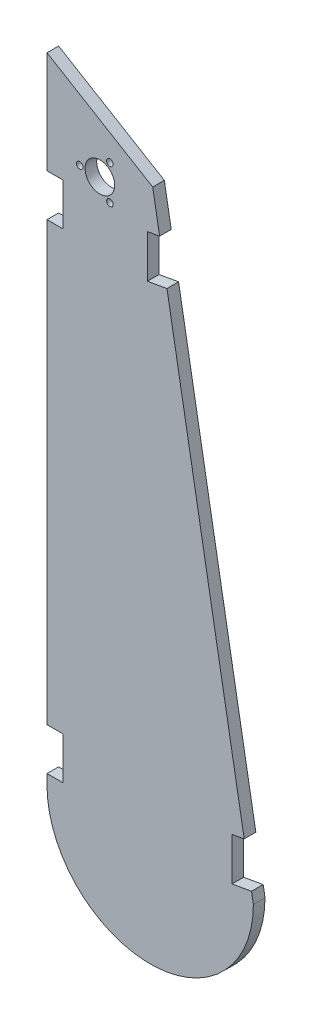
ISO-10303-21;
HEADER;
FILE_DESCRIPTION(('STEP AP214'),'2;1');
FILE_NAME('part.step','',(''),(''),'','','');
FILE_SCHEMA(('AUTOMOTIVE_DESIGN { 1 0 10303 214 1 1 1 1 }'));
ENDSEC;
DATA;
#1=APPLICATION_CONTEXT('core data for automotive mechanical design processes');
#2=APPLICATION_PROTOCOL_DEFINITION('international standard','automotive_design',2000,#1);
#3=PRODUCT_CONTEXT('',#1,'mechanical');
#4=PRODUCT('Part','Part','',(#3));
#5=PRODUCT_RELATED_PRODUCT_CATEGORY('part','',(#4));
#6=PRODUCT_DEFINITION_FORMATION('','',#4);
#7=PRODUCT_DEFINITION_CONTEXT('part definition',#1,'design');
#8=PRODUCT_DEFINITION('design','',#6,#7);
#9=PRODUCT_DEFINITION_SHAPE('','',#8);
#10=(LENGTH_UNIT() NAMED_UNIT(*) SI_UNIT(.MILLI.,.METRE.));
#11=(NAMED_UNIT(*) PLANE_ANGLE_UNIT() SI_UNIT($,.RADIAN.));
#12=(NAMED_UNIT(*) SI_UNIT($,.STERADIAN.) SOLID_ANGLE_UNIT());
#13=UNCERTAINTY_MEASURE_WITH_UNIT(LENGTH_MEASURE(1.E-05),#10,'distance_accuracy_value','');
#14=(GEOMETRIC_REPRESENTATION_CONTEXT(3) GLOBAL_UNCERTAINTY_ASSIGNED_CONTEXT((#13)) GLOBAL_UNIT_ASSIGNED_CONTEXT((#10,
#11,#12)) REPRESENTATION_CONTEXT('',''));
#15=CARTESIAN_POINT('',(0.,0.,0.));
#16=DIRECTION('',(0.,0.,1.));
#17=DIRECTION('',(1.,0.,0.));
#18=AXIS2_PLACEMENT_3D('',#15,#16,#17);
#19=CARTESIAN_POINT('',(50.,270.,5.5));
#20=DIRECTION('',(0.984807753012209,0.173648177666924,0.));
#21=DIRECTION('',(-0.173648177666924,0.984807753012209,0.));
#22=AXIS2_PLACEMENT_3D('',#19,#20,#21);
#23=PLANE('',#22);
#24=DIRECTION('',(0.,0.,-1.));
#25=VECTOR('',#24,1.);
#26=CARTESIAN_POINT('',(56.7364817766692,231.795513371788,5.5));
#27=LINE('',#26,#25);
#28=CARTESIAN_POINT('',(56.7364817766692,231.795513371788,5.5));
#29=VERTEX_POINT('',#28);
#30=CARTESIAN_POINT('',(56.7364817766692,231.795513371788,0.));
#31=VERTEX_POINT('',#30);
#32=EDGE_CURVE('E199',#29,#31,#27,.T.);
#33=ORIENTED_EDGE('',*,*,#32,.F.);
#34=DIRECTION('',(0.173648177666924,-0.984807753012209,0.));
#35=VECTOR('',#34,1.);
#36=CARTESIAN_POINT('',(50.,270.,5.5));
#37=LINE('',#36,#35);
#38=CARTESIAN_POINT('',(93.2635182233308,24.6403956473151,5.5));
#39=VERTEX_POINT('',#38);
#40=EDGE_CURVE('E195',#29,#39,#37,.T.);
#41=ORIENTED_EDGE('',*,*,#40,.T.);
#42=DIRECTION('',(0.,0.,-1.));
#43=VECTOR('',#42,1.);
#44=CARTESIAN_POINT('',(93.2635182233308,24.6403956473151,5.5));
#45=LINE('',#44,#43);
#46=CARTESIAN_POINT('',(93.2635182233308,24.6403956473151,0.));
#47=VERTEX_POINT('',#46);
#48=EDGE_CURVE('E212',#39,#47,#45,.T.);
#49=ORIENTED_EDGE('',*,*,#48,.T.);
#50=DIRECTION('',(0.173648177666924,-0.984807753012209,0.));
#51=VECTOR('',#50,1.);
#52=CARTESIAN_POINT('',(50.,270.,0.));
#53=LINE('',#52,#51);
#54=EDGE_CURVE('E314',#31,#47,#53,.T.);
#55=ORIENTED_EDGE('',*,*,#54,.F.);
#56=EDGE_LOOP('',(#33,#41,#49,#55));
#57=FACE_BOUND('',#56,.T.);
#58=ADVANCED_FACE('F39',(#57),#23,.T.);
#59=CARTESIAN_POINT('',(96.7364817766692,4.94424058707089,0.));
#60=VERTEX_POINT('',#59);
#61=CARTESIAN_POINT('',(97.6082847912837,0.,0.));
#62=VERTEX_POINT('',#61);
#63=EDGE_CURVE('E309',#60,#62,#53,.T.);
#64=ORIENTED_EDGE('',*,*,#63,.F.);
#65=DIRECTION('',(0.,0.,-1.));
#66=VECTOR('',#65,1.);
#67=CARTESIAN_POINT('',(96.7364817766692,4.94424058707089,5.5));
#68=LINE('',#67,#66);
#69=CARTESIAN_POINT('',(96.7364817766692,4.94424058707089,5.5));
#70=VERTEX_POINT('',#69);
#71=EDGE_CURVE('E215',#70,#60,#68,.T.);
#72=ORIENTED_EDGE('',*,*,#71,.F.);
#73=CARTESIAN_POINT('',(97.6082847912837,0.,5.5));
#74=VERTEX_POINT('',#73);
#75=EDGE_CURVE('E293',#70,#74,#37,.T.);
#76=ORIENTED_EDGE('',*,*,#75,.T.);
#77=DIRECTION('',(0.,0.,-1.));
#78=VECTOR('',#77,1.);
#79=CARTESIAN_POINT('',(97.6082847912837,0.,5.5));
#80=LINE('',#79,#78);
#81=EDGE_CURVE('E327',#74,#62,#80,.T.);
#82=ORIENTED_EDGE('',*,*,#81,.T.);
#83=EDGE_LOOP('',(#64,#72,#76,#82));
#84=FACE_BOUND('',#83,.T.);
#85=ADVANCED_FACE('F395',(#84),#23,.T.);
#86=DIRECTION('',(0.,0.,-1.));
#87=VECTOR('',#86,1.);
#88=CARTESIAN_POINT('',(53.2635182233308,251.491668432032,5.5));
#89=LINE('',#88,#87);
#90=CARTESIAN_POINT('',(53.2635182233308,251.491668432032,5.5));
#91=VERTEX_POINT('',#90);
#92=CARTESIAN_POINT('',(53.2635182233308,251.491668432032,0.));
#93=VERTEX_POINT('',#92);
#94=EDGE_CURVE('E202',#91,#93,#89,.T.);
#95=ORIENTED_EDGE('',*,*,#94,.T.);
#96=CARTESIAN_POINT('',(50.,270.,0.));
#97=VERTEX_POINT('',#96);
#98=EDGE_CURVE('E310',#97,#93,#53,.T.);
#99=ORIENTED_EDGE('',*,*,#98,.F.);
#100=DIRECTION('',(0.,0.,-1.));
#101=VECTOR('',#100,1.);
#102=CARTESIAN_POINT('',(50.,270.,5.5));
#103=LINE('',#102,#101);
#104=CARTESIAN_POINT('',(50.,270.,5.5));
#105=VERTEX_POINT('',#104);
#106=EDGE_CURVE('E305',#105,#97,#103,.T.);
#107=ORIENTED_EDGE('',*,*,#106,.F.);
#108=EDGE_CURVE('E295',#105,#91,#37,.T.);
#109=ORIENTED_EDGE('',*,*,#108,.T.);
#110=EDGE_LOOP('',(#95,#99,#107,#109));
#111=FACE_BOUND('',#110,.T.);
#112=ADVANCED_FACE('F353',(#111),#23,.T.);
#113=CARTESIAN_POINT('',(48.8041423956418,0.,5.5));
#114=DIRECTION('',(0.,0.,1.));
#115=DIRECTION('',(1.,0.,0.));
#116=AXIS2_PLACEMENT_3D('',#113,#114,#115);
#117=PLANE('',#116);
#118=DIRECTION('',(-0.984807753012208,-0.173648177666929,0.));
#119=VECTOR('',#118,1.);
#120=CARTESIAN_POINT('',(47.5,230.166872427739,5.5));
#121=LINE('',#120,#119);
#122=CARTESIAN_POINT('',(47.5,230.166872427739,5.5));
#123=VERTEX_POINT('',#122);
#124=EDGE_CURVE('E177',#29,#123,#121,.T.);
#125=ORIENTED_EDGE('',*,*,#124,.T.);
#126=DIRECTION('',(0.,1.,0.));
#127=VECTOR('',#126,1.);
#128=CARTESIAN_POINT('',(47.5,250.475404665454,5.5));
#129=LINE('',#128,#127);
#130=CARTESIAN_POINT('',(47.5,250.475404665454,5.5));
#131=VERTEX_POINT('',#130);
#132=EDGE_CURVE('E184',#123,#131,#129,.T.);
#133=ORIENTED_EDGE('',*,*,#132,.T.);
#134=DIRECTION('',(0.984807753012209,0.173648177666925,0.));
#135=VECTOR('',#134,1.);
#136=CARTESIAN_POINT('',(53.2635182233308,251.491668432032,5.5));
#137=LINE('',#136,#135);
#138=EDGE_CURVE('E181',#131,#91,#137,.T.);
#139=ORIENTED_EDGE('',*,*,#138,.T.);
#140=ORIENTED_EDGE('',*,*,#108,.F.);
#141=DIRECTION('',(0.857492925712544,-0.514495755427526,0.));
#142=VECTOR('',#141,1.);
#143=CARTESIAN_POINT('',(0.,300.,5.5));
#144=LINE('',#143,#142);
#145=CARTESIAN_POINT('',(0.,300.,5.5));
#146=VERTEX_POINT('',#145);
#147=EDGE_CURVE('E290',#146,#105,#144,.T.);
#148=ORIENTED_EDGE('',*,*,#147,.F.);
#149=DIRECTION('',(0.,1.,0.));
#150=VECTOR('',#149,1.);
#151=CARTESIAN_POINT('',(0.,0.,5.5));
#152=LINE('',#151,#150);
#153=CARTESIAN_POINT('',(0.,251.64359090191,5.5));
#154=VERTEX_POINT('',#153);
#155=EDGE_CURVE('E301',#154,#146,#152,.T.);
#156=ORIENTED_EDGE('',*,*,#155,.F.);
#157=DIRECTION('',(1.,0.,0.));
#158=VECTOR('',#157,1.);
#159=CARTESIAN_POINT('',(0.,251.64359090191,5.5));
#160=LINE('',#159,#158);
#161=CARTESIAN_POINT('',(7.5,251.64359090191,5.5));
#162=VERTEX_POINT('',#161);
#163=EDGE_CURVE('E220',#154,#162,#160,.T.);
#164=ORIENTED_EDGE('',*,*,#163,.T.);
#165=DIRECTION('',(0.,-1.,0.));
#166=VECTOR('',#165,1.);
#167=CARTESIAN_POINT('',(7.5,251.64359090191,5.5));
#168=LINE('',#167,#166);
#169=CARTESIAN_POINT('',(7.5,231.64359090191,5.5));
#170=VERTEX_POINT('',#169);
#171=EDGE_CURVE('E223',#162,#170,#168,.T.);
#172=ORIENTED_EDGE('',*,*,#171,.T.);
#173=DIRECTION('',(-1.,0.,0.));
#174=VECTOR('',#173,1.);
#175=CARTESIAN_POINT('',(7.5,231.64359090191,5.5));
#176=LINE('',#175,#174);
#177=CARTESIAN_POINT('',(0.,231.64359090191,5.5));
#178=VERTEX_POINT('',#177);
#179=EDGE_CURVE('E226',#170,#178,#176,.T.);
#180=ORIENTED_EDGE('',*,*,#179,.T.);
#181=CARTESIAN_POINT('',(0.,24.792318117193,5.5));
#182=VERTEX_POINT('',#181);
#183=EDGE_CURVE('E306',#182,#178,#152,.T.);
#184=ORIENTED_EDGE('',*,*,#183,.F.);
#185=DIRECTION('',(1.,0.,0.));
#186=VECTOR('',#185,1.);
#187=CARTESIAN_POINT('',(7.5,24.792318117193,5.5));
#188=LINE('',#187,#186);
#189=CARTESIAN_POINT('',(7.5,24.792318117193,5.5));
#190=VERTEX_POINT('',#189);
#191=EDGE_CURVE('E240',#182,#190,#188,.T.);
#192=ORIENTED_EDGE('',*,*,#191,.T.);
#193=DIRECTION('',(0.,-1.,0.));
#194=VECTOR('',#193,1.);
#195=CARTESIAN_POINT('',(7.5,4.79231811719299,5.5));
#196=LINE('',#195,#194);
#197=CARTESIAN_POINT('',(7.5,4.79231811719299,5.5));
#198=VERTEX_POINT('',#197);
#199=EDGE_CURVE('E243',#190,#198,#196,.T.);
#200=ORIENTED_EDGE('',*,*,#199,.T.);
#201=DIRECTION('',(-1.,0.,0.));
#202=VECTOR('',#201,1.);
#203=CARTESIAN_POINT('',(0.,4.79231811719299,5.5));
#204=LINE('',#203,#202);
#205=CARTESIAN_POINT('',(0.,4.79231811719299,5.5));
#206=VERTEX_POINT('',#205);
#207=EDGE_CURVE('E247',#198,#206,#204,.T.);
#208=ORIENTED_EDGE('',*,*,#207,.T.);
#209=CARTESIAN_POINT('',(0.,0.,5.5));
#210=VERTEX_POINT('',#209);
#211=EDGE_CURVE('E302',#210,#206,#152,.T.);
#212=ORIENTED_EDGE('',*,*,#211,.F.);
#213=CARTESIAN_POINT('',(48.8041423956418,0.,5.5));
#214=DIRECTION('',(0.,0.,1.));
#215=DIRECTION('',(1.,0.,0.));
#216=AXIS2_PLACEMENT_3D('',#213,#214,#215);
#217=CIRCLE('',#216,48.8041423956418);
#218=EDGE_CURVE('E298',#210,#74,#217,.T.);
#219=ORIENTED_EDGE('',*,*,#218,.T.);
#220=ORIENTED_EDGE('',*,*,#75,.F.);
#221=DIRECTION('',(0.98480775301221,0.173648177666922,0.));
#222=VECTOR('',#221,1.);
#223=CARTESIAN_POINT('',(87.5,3.31559964302212,5.5));
#224=LINE('',#223,#222);
#225=CARTESIAN_POINT('',(87.5,3.31559964302212,5.5));
#226=VERTEX_POINT('',#225);
#227=EDGE_CURVE('E207',#226,#70,#224,.T.);
#228=ORIENTED_EDGE('',*,*,#227,.F.);
#229=DIRECTION('',(0.,-1.,0.));
#230=VECTOR('',#229,1.);
#231=CARTESIAN_POINT('',(87.5,23.624131880737,5.5));
#232=LINE('',#231,#230);
#233=CARTESIAN_POINT('',(87.5,23.624131880737,5.5));
#234=VERTEX_POINT('',#233);
#235=EDGE_CURVE('E201',#234,#226,#232,.T.);
#236=ORIENTED_EDGE('',*,*,#235,.F.);
#237=DIRECTION('',(-0.984807753012209,-0.173648177666924,0.));
#238=VECTOR('',#237,1.);
#239=CARTESIAN_POINT('',(93.2635182233308,24.6403956473151,5.5));
#240=LINE('',#239,#238);
#241=EDGE_CURVE('E209',#39,#234,#240,.T.);
#242=ORIENTED_EDGE('',*,*,#241,.F.);
#243=ORIENTED_EDGE('',*,*,#40,.F.);
#244=EDGE_LOOP('',(#125,#133,#139,#140,#148,#156,#164,#172,#180,#184,#192,#200,#208,#212,#219,
#220,#228,#236,#242,#243));
#245=FACE_BOUND('',#244,.T.);
#246=CARTESIAN_POINT('',(29.75,269.870832237862,5.5));
#247=DIRECTION('',(0.,0.,-1.));
#248=DIRECTION('',(0.500000000000004,0.866025403784436,0.));
#249=AXIS2_PLACEMENT_3D('',#246,#247,#248);
#250=CIRCLE('',#249,1.55000000000001);
#251=CARTESIAN_POINT('',(30.525,271.213171613728,5.5));
#252=VERTEX_POINT('',#251);
#253=EDGE_CURVE('E266',#252,#252,#250,.T.);
#254=ORIENTED_EDGE('',*,*,#253,.T.);
#255=EDGE_LOOP('',(#254));
#256=FACE_BOUND('',#255,.T.);
#257=CARTESIAN_POINT('',(29.7499999999999,253.416349565958,5.5));
#258=DIRECTION('',(0.,0.,-1.));
#259=DIRECTION('',(0.499999999999992,-0.866025403784443,0.));
#260=AXIS2_PLACEMENT_3D('',#257,#258,#259);
#261=CIRCLE('',#260,1.55000000000001);
#262=CARTESIAN_POINT('',(30.5249999999999,252.074010190092,5.5));
#263=VERTEX_POINT('',#262);
#264=EDGE_CURVE('E273',#263,#263,#261,.T.);
#265=ORIENTED_EDGE('',*,*,#264,.T.);
#266=EDGE_LOOP('',(#265));
#267=FACE_BOUND('',#266,.T.);
#268=CARTESIAN_POINT('',(15.5,261.64359090191,5.5));
#269=DIRECTION('',(0.,0.,-1.));
#270=DIRECTION('',(-1.,0.,0.));
#271=AXIS2_PLACEMENT_3D('',#268,#269,#270);
#272=CIRCLE('',#271,1.55000000000001);
#273=CARTESIAN_POINT('',(13.95,261.64359090191,5.5));
#274=VERTEX_POINT('',#273);
#275=EDGE_CURVE('E278',#274,#274,#272,.T.);
#276=ORIENTED_EDGE('',*,*,#275,.T.);
#277=EDGE_LOOP('',(#276));
#278=FACE_BOUND('',#277,.T.);
#279=CARTESIAN_POINT('',(25.,261.64359090191,5.5));
#280=DIRECTION('',(0.,0.,-1.));
#281=DIRECTION('',(-1.,0.,0.));
#282=AXIS2_PLACEMENT_3D('',#279,#280,#281);
#283=CIRCLE('',#282,7.);
#284=CARTESIAN_POINT('',(18.,261.64359090191,5.5));
#285=VERTEX_POINT('',#284);
#286=EDGE_CURVE('E284',#285,#285,#283,.T.);
#287=ORIENTED_EDGE('',*,*,#286,.T.);
#288=EDGE_LOOP('',(#287));
#289=FACE_BOUND('',#288,.T.);
#290=ADVANCED_FACE('F192',(#245,#256,#267,#278,#289),#117,.T.);
#291=CARTESIAN_POINT('',(48.8041423956418,0.,0.));
#292=DIRECTION('',(0.,0.,1.));
#293=DIRECTION('',(1.,0.,0.));
#294=AXIS2_PLACEMENT_3D('',#291,#292,#293);
#295=PLANE('',#294);
#296=CARTESIAN_POINT('',(25.,261.64359090191,0.));
#297=DIRECTION('',(0.,0.,-1.));
#298=DIRECTION('',(-1.,0.,0.));
#299=AXIS2_PLACEMENT_3D('',#296,#297,#298);
#300=CIRCLE('',#299,7.);
#301=CARTESIAN_POINT('',(18.,261.64359090191,0.));
#302=VERTEX_POINT('',#301);
#303=EDGE_CURVE('E281',#302,#302,#300,.T.);
#304=ORIENTED_EDGE('',*,*,#303,.F.);
#305=EDGE_LOOP('',(#304));
#306=FACE_BOUND('',#305,.T.);
#307=CARTESIAN_POINT('',(15.5,261.64359090191,0.));
#308=DIRECTION('',(0.,0.,-1.));
#309=DIRECTION('',(-1.,0.,0.));
#310=AXIS2_PLACEMENT_3D('',#307,#308,#309);
#311=CIRCLE('',#310,1.55000000000001);
#312=CARTESIAN_POINT('',(13.95,261.64359090191,0.));
#313=VERTEX_POINT('',#312);
#314=EDGE_CURVE('E269',#313,#313,#311,.T.);
#315=ORIENTED_EDGE('',*,*,#314,.F.);
#316=EDGE_LOOP('',(#315));
#317=FACE_BOUND('',#316,.T.);
#318=CARTESIAN_POINT('',(29.7499999999999,253.416349565958,0.));
#319=DIRECTION('',(0.,0.,-1.));
#320=DIRECTION('',(0.499999999999992,-0.866025403784443,0.));
#321=AXIS2_PLACEMENT_3D('',#318,#319,#320);
#322=CIRCLE('',#321,1.55000000000001);
#323=CARTESIAN_POINT('',(30.5249999999999,252.074010190092,0.));
#324=VERTEX_POINT('',#323);
#325=EDGE_CURVE('E258',#324,#324,#322,.T.);
#326=ORIENTED_EDGE('',*,*,#325,.F.);
#327=EDGE_LOOP('',(#326));
#328=FACE_BOUND('',#327,.T.);
#329=CARTESIAN_POINT('',(29.75,269.870832237862,0.));
#330=DIRECTION('',(0.,0.,-1.));
#331=DIRECTION('',(0.500000000000004,0.866025403784436,0.));
#332=AXIS2_PLACEMENT_3D('',#329,#330,#331);
#333=CIRCLE('',#332,1.55000000000001);
#334=CARTESIAN_POINT('',(30.525,271.213171613728,0.));
#335=VERTEX_POINT('',#334);
#336=EDGE_CURVE('E270',#335,#335,#333,.T.);
#337=ORIENTED_EDGE('',*,*,#336,.F.);
#338=EDGE_LOOP('',(#337));
#339=FACE_BOUND('',#338,.T.);
#340=DIRECTION('',(0.,-1.,0.));
#341=VECTOR('',#340,1.);
#342=CARTESIAN_POINT('',(47.5,0.,0.));
#343=LINE('',#342,#341);
#344=CARTESIAN_POINT('',(47.5,250.475404665454,0.));
#345=VERTEX_POINT('',#344);
#346=CARTESIAN_POINT('',(47.5,230.166872427739,0.));
#347=VERTEX_POINT('',#346);
#348=EDGE_CURVE('E345',#345,#347,#343,.T.);
#349=ORIENTED_EDGE('',*,*,#348,.T.);
#350=DIRECTION('',(0.984807753012208,0.173648177666929,0.));
#351=VECTOR('',#350,1.);
#352=CARTESIAN_POINT('',(9.40396434236243,223.449513483266,0.));
#353=LINE('',#352,#351);
#354=EDGE_CURVE('E11',#347,#31,#353,.T.);
#355=ORIENTED_EDGE('',*,*,#354,.T.);
#356=ORIENTED_EDGE('',*,*,#54,.T.);
#357=DIRECTION('',(0.984807753012209,0.173648177666924,0.));
#358=VECTOR('',#357,1.);
#359=CARTESIAN_POINT('',(45.9310007890251,16.2943957587935,0.));
#360=LINE('',#359,#358);
#361=CARTESIAN_POINT('',(87.5,23.624131880737,0.));
#362=VERTEX_POINT('',#361);
#363=EDGE_CURVE('E339',#362,#47,#360,.T.);
#364=ORIENTED_EDGE('',*,*,#363,.F.);
#365=DIRECTION('',(0.,1.,0.));
#366=VECTOR('',#365,1.);
#367=CARTESIAN_POINT('',(87.5,0.,0.));
#368=LINE('',#367,#366);
#369=CARTESIAN_POINT('',(87.5,3.31559964302212,0.));
#370=VERTEX_POINT('',#369);
#371=EDGE_CURVE('E341',#370,#362,#368,.T.);
#372=ORIENTED_EDGE('',*,*,#371,.F.);
#373=DIRECTION('',(-0.984807753012209,-0.173648177666922,0.));
#374=VECTOR('',#373,1.);
#375=CARTESIAN_POINT('',(49.4039643423635,-3.40175930145061,0.));
#376=LINE('',#375,#374);
#377=EDGE_CURVE('E343',#60,#370,#376,.T.);
#378=ORIENTED_EDGE('',*,*,#377,.F.);
#379=ORIENTED_EDGE('',*,*,#63,.T.);
#380=CARTESIAN_POINT('',(48.8041423956418,0.,0.));
#381=DIRECTION('',(0.,0.,1.));
#382=DIRECTION('',(1.,0.,0.));
#383=AXIS2_PLACEMENT_3D('',#380,#381,#382);
#384=CIRCLE('',#383,48.8041423956418);
#385=CARTESIAN_POINT('',(0.,0.,0.));
#386=VERTEX_POINT('',#385);
#387=EDGE_CURVE('E313',#386,#62,#384,.T.);
#388=ORIENTED_EDGE('',*,*,#387,.F.);
#389=DIRECTION('',(0.,1.,0.));
#390=VECTOR('',#389,1.);
#391=CARTESIAN_POINT('',(0.,0.,0.));
#392=LINE('',#391,#390);
#393=CARTESIAN_POINT('',(0.,4.79231811719299,0.));
#394=VERTEX_POINT('',#393);
#395=EDGE_CURVE('E294',#386,#394,#392,.T.);
#396=ORIENTED_EDGE('',*,*,#395,.T.);
#397=DIRECTION('',(-1.,0.,0.));
#398=VECTOR('',#397,1.);
#399=CARTESIAN_POINT('',(0.,4.79231811719299,0.));
#400=LINE('',#399,#398);
#401=CARTESIAN_POINT('',(7.5,4.79231811719299,0.));
#402=VERTEX_POINT('',#401);
#403=EDGE_CURVE('E244',#402,#394,#400,.T.);
#404=ORIENTED_EDGE('',*,*,#403,.F.);
#405=DIRECTION('',(0.,-1.,0.));
#406=VECTOR('',#405,1.);
#407=CARTESIAN_POINT('',(7.5,4.79231811719299,0.));
#408=LINE('',#407,#406);
#409=CARTESIAN_POINT('',(7.5,24.792318117193,0.));
#410=VERTEX_POINT('',#409);
#411=EDGE_CURVE('E252',#410,#402,#408,.T.);
#412=ORIENTED_EDGE('',*,*,#411,.F.);
#413=DIRECTION('',(1.,0.,0.));
#414=VECTOR('',#413,1.);
#415=CARTESIAN_POINT('',(7.5,24.792318117193,0.));
#416=LINE('',#415,#414);
#417=CARTESIAN_POINT('',(0.,24.792318117193,0.));
#418=VERTEX_POINT('',#417);
#419=EDGE_CURVE('E232',#418,#410,#416,.T.);
#420=ORIENTED_EDGE('',*,*,#419,.F.);
#421=CARTESIAN_POINT('',(0.,231.64359090191,0.));
#422=VERTEX_POINT('',#421);
#423=EDGE_CURVE('E320',#418,#422,#392,.T.);
#424=ORIENTED_EDGE('',*,*,#423,.T.);
#425=DIRECTION('',(1.,0.,0.));
#426=VECTOR('',#425,1.);
#427=CARTESIAN_POINT('',(48.804142395641,231.643590901911,0.));
#428=LINE('',#427,#426);
#429=CARTESIAN_POINT('',(7.5,231.64359090191,0.));
#430=VERTEX_POINT('',#429);
#431=EDGE_CURVE('E333',#422,#430,#428,.T.);
#432=ORIENTED_EDGE('',*,*,#431,.T.);
#433=DIRECTION('',(0.,1.,0.));
#434=VECTOR('',#433,1.);
#435=CARTESIAN_POINT('',(7.49999999999997,0.,0.));
#436=LINE('',#435,#434);
#437=CARTESIAN_POINT('',(7.50000000000001,251.64359090191,0.));
#438=VERTEX_POINT('',#437);
#439=EDGE_CURVE('E324',#430,#438,#436,.T.);
#440=ORIENTED_EDGE('',*,*,#439,.T.);
#441=DIRECTION('',(-1.,0.,0.));
#442=VECTOR('',#441,1.);
#443=CARTESIAN_POINT('',(48.8041423956418,251.64359090191,0.));
#444=LINE('',#443,#442);
#445=CARTESIAN_POINT('',(0.,251.64359090191,0.));
#446=VERTEX_POINT('',#445);
#447=EDGE_CURVE('E336',#438,#446,#444,.T.);
#448=ORIENTED_EDGE('',*,*,#447,.T.);
#449=CARTESIAN_POINT('',(0.,300.,0.));
#450=VERTEX_POINT('',#449);
#451=EDGE_CURVE('E317',#446,#450,#392,.T.);
#452=ORIENTED_EDGE('',*,*,#451,.T.);
#453=DIRECTION('',(0.857492925712544,-0.514495755427526,0.));
#454=VECTOR('',#453,1.);
#455=CARTESIAN_POINT('',(0.,300.,0.));
#456=LINE('',#455,#454);
#457=EDGE_CURVE('E287',#450,#97,#456,.T.);
#458=ORIENTED_EDGE('',*,*,#457,.T.);
#459=ORIENTED_EDGE('',*,*,#98,.T.);
#460=DIRECTION('',(-0.984807753012209,-0.173648177666925,0.));
#461=VECTOR('',#460,1.);
#462=CARTESIAN_POINT('',(5.93100078902478,243.145668543511,0.));
#463=LINE('',#462,#461);
#464=EDGE_CURVE('E47',#93,#345,#463,.T.);
#465=ORIENTED_EDGE('',*,*,#464,.T.);
#466=EDGE_LOOP('',(#349,#355,#356,#364,#372,#378,#379,#388,#396,#404,#412,#420,#424,#432,#440,
#448,#452,#458,#459,#465));
#467=FACE_BOUND('',#466,.T.);
#468=ADVANCED_FACE('F348',(#306,#317,#328,#339,#467),#295,.F.);
#469=CARTESIAN_POINT('',(0.,0.,5.5));
#470=DIRECTION('',(-1.,0.,0.));
#471=DIRECTION('',(0.,0.,1.));
#472=AXIS2_PLACEMENT_3D('',#469,#470,#471);
#473=PLANE('',#472);
#474=DIRECTION('',(0.,0.,-1.));
#475=VECTOR('',#474,1.);
#476=CARTESIAN_POINT('',(0.,251.64359090191,5.5));
#477=LINE('',#476,#475);
#478=EDGE_CURVE('E230',#154,#446,#477,.T.);
#479=ORIENTED_EDGE('',*,*,#478,.F.);
#480=ORIENTED_EDGE('',*,*,#155,.T.);
#481=DIRECTION('',(0.,0.,-1.));
#482=VECTOR('',#481,1.);
#483=CARTESIAN_POINT('',(0.,300.,5.5));
#484=LINE('',#483,#482);
#485=EDGE_CURVE('E321',#146,#450,#484,.T.);
#486=ORIENTED_EDGE('',*,*,#485,.T.);
#487=ORIENTED_EDGE('',*,*,#451,.F.);
#488=EDGE_LOOP('',(#479,#480,#486,#487));
#489=FACE_BOUND('',#488,.T.);
#490=ADVANCED_FACE('F363',(#489),#473,.T.);
#491=DIRECTION('',(0.,0.,-1.));
#492=VECTOR('',#491,1.);
#493=CARTESIAN_POINT('',(0.,231.64359090191,5.5));
#494=LINE('',#493,#492);
#495=EDGE_CURVE('E233',#178,#422,#494,.T.);
#496=ORIENTED_EDGE('',*,*,#495,.T.);
#497=ORIENTED_EDGE('',*,*,#423,.F.);
#498=DIRECTION('',(0.,0.,-1.));
#499=VECTOR('',#498,1.);
#500=CARTESIAN_POINT('',(0.,24.792318117193,5.5));
#501=LINE('',#500,#499);
#502=EDGE_CURVE('E256',#182,#418,#501,.T.);
#503=ORIENTED_EDGE('',*,*,#502,.F.);
#504=ORIENTED_EDGE('',*,*,#183,.T.);
#505=EDGE_LOOP('',(#496,#497,#503,#504));
#506=FACE_BOUND('',#505,.T.);
#507=ADVANCED_FACE('F368',(#506),#473,.T.);
#508=CARTESIAN_POINT('',(0.,300.,5.5));
#509=DIRECTION('',(0.514495755427526,0.857492925712545,0.));
#510=DIRECTION('',(-0.857492925712545,0.514495755427526,0.));
#511=AXIS2_PLACEMENT_3D('',#508,#509,#510);
#512=PLANE('',#511);
#513=ORIENTED_EDGE('',*,*,#457,.F.);
#514=ORIENTED_EDGE('',*,*,#485,.F.);
#515=ORIENTED_EDGE('',*,*,#147,.T.);
#516=ORIENTED_EDGE('',*,*,#106,.T.);
#517=EDGE_LOOP('',(#513,#514,#515,#516));
#518=FACE_BOUND('',#517,.T.);
#519=ADVANCED_FACE('F41',(#518),#512,.T.);
#520=DIRECTION('',(0.,0.,-1.));
#521=VECTOR('',#520,1.);
#522=CARTESIAN_POINT('',(0.,4.79231811719299,5.5));
#523=LINE('',#522,#521);
#524=EDGE_CURVE('E259',#206,#394,#523,.T.);
#525=ORIENTED_EDGE('',*,*,#524,.T.);
#526=ORIENTED_EDGE('',*,*,#395,.F.);
#527=DIRECTION('',(0.,0.,-1.));
#528=VECTOR('',#527,1.);
#529=CARTESIAN_POINT('',(0.,0.,5.5));
#530=LINE('',#529,#528);
#531=EDGE_CURVE('E325',#210,#386,#530,.T.);
#532=ORIENTED_EDGE('',*,*,#531,.F.);
#533=ORIENTED_EDGE('',*,*,#211,.T.);
#534=EDGE_LOOP('',(#525,#526,#532,#533));
#535=FACE_BOUND('',#534,.T.);
#536=ADVANCED_FACE('F417',(#535),#473,.T.);
#537=CARTESIAN_POINT('',(48.8041423956418,0.,5.5));
#538=DIRECTION('',(0.,0.,-1.));
#539=DIRECTION('',(-1.,0.,0.));
#540=AXIS2_PLACEMENT_3D('',#537,#538,#539);
#541=CYLINDRICAL_SURFACE('',#540,48.8041423956418);
#542=ORIENTED_EDGE('',*,*,#387,.T.);
#543=ORIENTED_EDGE('',*,*,#81,.F.);
#544=ORIENTED_EDGE('',*,*,#218,.F.);
#545=ORIENTED_EDGE('',*,*,#531,.T.);
#546=EDGE_LOOP('',(#542,#543,#544,#545));
#547=FACE_BOUND('',#546,.T.);
#548=ADVANCED_FACE('F419',(#547),#541,.T.);
#549=CARTESIAN_POINT('',(25.,261.64359090191,5.5));
#550=DIRECTION('',(0.,0.,-1.));
#551=DIRECTION('',(-1.,0.,0.));
#552=AXIS2_PLACEMENT_3D('',#549,#550,#551);
#553=CYLINDRICAL_SURFACE('',#552,7.);
#554=ORIENTED_EDGE('',*,*,#286,.F.);
#555=EDGE_LOOP('',(#554));
#556=FACE_BOUND('',#555,.T.);
#557=ORIENTED_EDGE('',*,*,#303,.T.);
#558=EDGE_LOOP('',(#557));
#559=FACE_BOUND('',#558,.T.);
#560=ADVANCED_FACE('F414',(#556,#559),#553,.F.);
#561=CARTESIAN_POINT('',(15.5,261.64359090191,5.5));
#562=DIRECTION('',(0.,0.,-1.));
#563=DIRECTION('',(-1.,0.,0.));
#564=AXIS2_PLACEMENT_3D('',#561,#562,#563);
#565=CYLINDRICAL_SURFACE('',#564,1.55000000000001);
#566=ORIENTED_EDGE('',*,*,#275,.F.);
#567=EDGE_LOOP('',(#566));
#568=FACE_BOUND('',#567,.T.);
#569=ORIENTED_EDGE('',*,*,#314,.T.);
#570=EDGE_LOOP('',(#569));
#571=FACE_BOUND('',#570,.T.);
#572=ADVANCED_FACE('F428',(#568,#571),#565,.F.);
#573=CARTESIAN_POINT('',(29.7499999999999,253.416349565958,5.5));
#574=DIRECTION('',(0.,0.,-1.));
#575=DIRECTION('',(-1.,0.,0.));
#576=AXIS2_PLACEMENT_3D('',#573,#574,#575);
#577=CYLINDRICAL_SURFACE('',#576,1.55000000000001);
#578=ORIENTED_EDGE('',*,*,#264,.F.);
#579=EDGE_LOOP('',(#578));
#580=FACE_BOUND('',#579,.T.);
#581=ORIENTED_EDGE('',*,*,#325,.T.);
#582=EDGE_LOOP('',(#581));
#583=FACE_BOUND('',#582,.T.);
#584=ADVANCED_FACE('F454',(#580,#583),#577,.F.);
#585=CARTESIAN_POINT('',(29.75,269.870832237862,5.5));
#586=DIRECTION('',(0.,0.,-1.));
#587=DIRECTION('',(-1.,0.,0.));
#588=AXIS2_PLACEMENT_3D('',#585,#586,#587);
#589=CYLINDRICAL_SURFACE('',#588,1.55000000000001);
#590=ORIENTED_EDGE('',*,*,#253,.F.);
#591=EDGE_LOOP('',(#590));
#592=FACE_BOUND('',#591,.T.);
#593=ORIENTED_EDGE('',*,*,#336,.T.);
#594=EDGE_LOOP('',(#593));
#595=FACE_BOUND('',#594,.T.);
#596=ADVANCED_FACE('F447',(#592,#595),#589,.F.);
#597=CARTESIAN_POINT('',(7.5,24.792318117193,5.5));
#598=DIRECTION('',(0.,1.,0.));
#599=DIRECTION('',(0.,0.,1.));
#600=AXIS2_PLACEMENT_3D('',#597,#598,#599);
#601=PLANE('',#600);
#602=ORIENTED_EDGE('',*,*,#419,.T.);
#603=DIRECTION('',(0.,0.,-1.));
#604=VECTOR('',#603,1.);
#605=CARTESIAN_POINT('',(7.5,24.792318117193,5.5));
#606=LINE('',#605,#604);
#607=EDGE_CURVE('E250',#190,#410,#606,.T.);
#608=ORIENTED_EDGE('',*,*,#607,.F.);
#609=ORIENTED_EDGE('',*,*,#191,.F.);
#610=ORIENTED_EDGE('',*,*,#502,.T.);
#611=EDGE_LOOP('',(#602,#608,#609,#610));
#612=FACE_BOUND('',#611,.T.);
#613=ADVANCED_FACE('F445',(#612),#601,.F.);
#614=CARTESIAN_POINT('',(0.,4.79231811719299,5.5));
#615=DIRECTION('',(0.,-1.,0.));
#616=DIRECTION('',(1.,0.,0.));
#617=AXIS2_PLACEMENT_3D('',#614,#615,#616);
#618=PLANE('',#617);
#619=ORIENTED_EDGE('',*,*,#403,.T.);
#620=ORIENTED_EDGE('',*,*,#524,.F.);
#621=ORIENTED_EDGE('',*,*,#207,.F.);
#622=DIRECTION('',(0.,0.,-1.));
#623=VECTOR('',#622,1.);
#624=CARTESIAN_POINT('',(7.5,4.79231811719299,5.5));
#625=LINE('',#624,#623);
#626=EDGE_CURVE('E262',#198,#402,#625,.T.);
#627=ORIENTED_EDGE('',*,*,#626,.T.);
#628=EDGE_LOOP('',(#619,#620,#621,#627));
#629=FACE_BOUND('',#628,.T.);
#630=ADVANCED_FACE('F440',(#629),#618,.F.);
#631=CARTESIAN_POINT('',(7.5,4.79231811719299,5.5));
#632=DIRECTION('',(1.,0.,0.));
#633=DIRECTION('',(0.,1.,0.));
#634=AXIS2_PLACEMENT_3D('',#631,#632,#633);
#635=PLANE('',#634);
#636=ORIENTED_EDGE('',*,*,#411,.T.);
#637=ORIENTED_EDGE('',*,*,#626,.F.);
#638=ORIENTED_EDGE('',*,*,#199,.F.);
#639=ORIENTED_EDGE('',*,*,#607,.T.);
#640=EDGE_LOOP('',(#636,#637,#638,#639));
#641=FACE_BOUND('',#640,.T.);
#642=ADVANCED_FACE('F443',(#641),#635,.F.);
#643=CARTESIAN_POINT('',(0.,251.64359090191,5.5));
#644=DIRECTION('',(0.,1.,0.));
#645=DIRECTION('',(0.,0.,1.));
#646=AXIS2_PLACEMENT_3D('',#643,#644,#645);
#647=PLANE('',#646);
#648=DIRECTION('',(0.,0.,-1.));
#649=VECTOR('',#648,1.);
#650=CARTESIAN_POINT('',(7.5,251.64359090191,5.5));
#651=LINE('',#650,#649);
#652=EDGE_CURVE('E229',#162,#438,#651,.T.);
#653=ORIENTED_EDGE('',*,*,#652,.F.);
#654=ORIENTED_EDGE('',*,*,#163,.F.);
#655=ORIENTED_EDGE('',*,*,#478,.T.);
#656=ORIENTED_EDGE('',*,*,#447,.F.);
#657=EDGE_LOOP('',(#653,#654,#655,#656));
#658=FACE_BOUND('',#657,.T.);
#659=ADVANCED_FACE('F379',(#658),#647,.F.);
#660=CARTESIAN_POINT('',(7.5,231.64359090191,5.5));
#661=DIRECTION('',(0.,-1.,0.));
#662=DIRECTION('',(1.,0.,0.));
#663=AXIS2_PLACEMENT_3D('',#660,#661,#662);
#664=PLANE('',#663);
#665=ORIENTED_EDGE('',*,*,#495,.F.);
#666=ORIENTED_EDGE('',*,*,#179,.F.);
#667=DIRECTION('',(0.,0.,-1.));
#668=VECTOR('',#667,1.);
#669=CARTESIAN_POINT('',(7.5,231.64359090191,5.5));
#670=LINE('',#669,#668);
#671=EDGE_CURVE('E236',#170,#430,#670,.T.);
#672=ORIENTED_EDGE('',*,*,#671,.T.);
#673=ORIENTED_EDGE('',*,*,#431,.F.);
#674=EDGE_LOOP('',(#665,#666,#672,#673));
#675=FACE_BOUND('',#674,.T.);
#676=ADVANCED_FACE('F374',(#675),#664,.F.);
#677=CARTESIAN_POINT('',(7.5,251.64359090191,5.5));
#678=DIRECTION('',(1.,0.,0.));
#679=DIRECTION('',(0.,1.,0.));
#680=AXIS2_PLACEMENT_3D('',#677,#678,#679);
#681=PLANE('',#680);
#682=ORIENTED_EDGE('',*,*,#671,.F.);
#683=ORIENTED_EDGE('',*,*,#171,.F.);
#684=ORIENTED_EDGE('',*,*,#652,.T.);
#685=ORIENTED_EDGE('',*,*,#439,.F.);
#686=EDGE_LOOP('',(#682,#683,#684,#685));
#687=FACE_BOUND('',#686,.T.);
#688=ADVANCED_FACE('F381',(#687),#681,.F.);
#689=CARTESIAN_POINT('',(87.5,23.624131880737,5.5));
#690=DIRECTION('',(1.,0.,0.));
#691=DIRECTION('',(0.,0.,-1.));
#692=AXIS2_PLACEMENT_3D('',#689,#690,#691);
#693=PLANE('',#692);
#694=ORIENTED_EDGE('',*,*,#371,.T.);
#695=DIRECTION('',(0.,0.,-1.));
#696=VECTOR('',#695,1.);
#697=CARTESIAN_POINT('',(87.5,23.624131880737,5.5));
#698=LINE('',#697,#696);
#699=EDGE_CURVE('E62',#234,#362,#698,.T.);
#700=ORIENTED_EDGE('',*,*,#699,.F.);
#701=ORIENTED_EDGE('',*,*,#235,.T.);
#702=DIRECTION('',(0.,0.,-1.));
#703=VECTOR('',#702,1.);
#704=CARTESIAN_POINT('',(87.5,3.31559964302212,5.5));
#705=LINE('',#704,#703);
#706=EDGE_CURVE('E217',#226,#370,#705,.T.);
#707=ORIENTED_EDGE('',*,*,#706,.T.);
#708=EDGE_LOOP('',(#694,#700,#701,#707));
#709=FACE_BOUND('',#708,.T.);
#710=ADVANCED_FACE('F383',(#709),#693,.T.);
#711=CARTESIAN_POINT('',(87.5,3.31559964302212,5.5));
#712=DIRECTION('',(-0.173648177666922,0.984807753012209,0.));
#713=DIRECTION('',(-0.984807753012209,-0.173648177666922,0.));
#714=AXIS2_PLACEMENT_3D('',#711,#712,#713);
#715=PLANE('',#714);
#716=ORIENTED_EDGE('',*,*,#377,.T.);
#717=ORIENTED_EDGE('',*,*,#706,.F.);
#718=ORIENTED_EDGE('',*,*,#227,.T.);
#719=ORIENTED_EDGE('',*,*,#71,.T.);
#720=EDGE_LOOP('',(#716,#717,#718,#719));
#721=FACE_BOUND('',#720,.T.);
#722=ADVANCED_FACE('F389',(#721),#715,.T.);
#723=CARTESIAN_POINT('',(93.2635182233308,24.6403956473151,5.5));
#724=DIRECTION('',(0.173648177666924,-0.984807753012209,0.));
#725=DIRECTION('',(0.984807753012209,0.173648177666924,0.));
#726=AXIS2_PLACEMENT_3D('',#723,#724,#725);
#727=PLANE('',#726);
#728=ORIENTED_EDGE('',*,*,#363,.T.);
#729=ORIENTED_EDGE('',*,*,#48,.F.);
#730=ORIENTED_EDGE('',*,*,#241,.T.);
#731=ORIENTED_EDGE('',*,*,#699,.T.);
#732=EDGE_LOOP('',(#728,#729,#730,#731));
#733=FACE_BOUND('',#732,.T.);
#734=ADVANCED_FACE('F566',(#733),#727,.T.);
#735=CARTESIAN_POINT('',(47.5,230.166872427739,5.5));
#736=DIRECTION('',(0.173648177666929,-0.984807753012208,0.));
#737=DIRECTION('',(0.984807753012208,0.173648177666929,0.));
#738=AXIS2_PLACEMENT_3D('',#735,#736,#737);
#739=PLANE('',#738);
#740=DIRECTION('',(0.,0.,-1.));
#741=VECTOR('',#740,1.);
#742=CARTESIAN_POINT('',(47.5,230.166872427739,5.5));
#743=LINE('',#742,#741);
#744=EDGE_CURVE('E54',#123,#347,#743,.T.);
#745=ORIENTED_EDGE('',*,*,#744,.F.);
#746=ORIENTED_EDGE('',*,*,#124,.F.);
#747=ORIENTED_EDGE('',*,*,#32,.T.);
#748=ORIENTED_EDGE('',*,*,#354,.F.);
#749=EDGE_LOOP('',(#745,#746,#747,#748));
#750=FACE_BOUND('',#749,.T.);
#751=ADVANCED_FACE('F175',(#750),#739,.F.);
#752=CARTESIAN_POINT('',(53.2635182233308,251.491668432032,5.5));
#753=DIRECTION('',(-0.173648177666925,0.984807753012209,0.));
#754=DIRECTION('',(-0.984807753012209,-0.173648177666925,0.));
#755=AXIS2_PLACEMENT_3D('',#752,#753,#754);
#756=PLANE('',#755);
#757=ORIENTED_EDGE('',*,*,#94,.F.);
#758=ORIENTED_EDGE('',*,*,#138,.F.);
#759=DIRECTION('',(0.,0.,-1.));
#760=VECTOR('',#759,1.);
#761=CARTESIAN_POINT('',(47.5,250.475404665454,5.5));
#762=LINE('',#761,#760);
#763=EDGE_CURVE('E180',#131,#345,#762,.T.);
#764=ORIENTED_EDGE('',*,*,#763,.T.);
#765=ORIENTED_EDGE('',*,*,#464,.F.);
#766=EDGE_LOOP('',(#757,#758,#764,#765));
#767=FACE_BOUND('',#766,.T.);
#768=ADVANCED_FACE('F351',(#767),#756,.F.);
#769=CARTESIAN_POINT('',(47.5,250.475404665454,5.5));
#770=DIRECTION('',(-1.,0.,0.));
#771=DIRECTION('',(0.,0.,1.));
#772=AXIS2_PLACEMENT_3D('',#769,#770,#771);
#773=PLANE('',#772);
#774=ORIENTED_EDGE('',*,*,#763,.F.);
#775=ORIENTED_EDGE('',*,*,#132,.F.);
#776=ORIENTED_EDGE('',*,*,#744,.T.);
#777=ORIENTED_EDGE('',*,*,#348,.F.);
#778=EDGE_LOOP('',(#774,#775,#776,#777));
#779=FACE_BOUND('',#778,.T.);
#780=ADVANCED_FACE('F185',(#779),#773,.F.);
#781=CLOSED_SHELL('',(#58,#85,#112,#290,#468,#490,#507,#519,#536,#548,#560,#572,#584,#596,#613,
#630,#642,#659,#676,#688,#710,#722,#734,#751,#768,#780));
#782=MANIFOLD_SOLID_BREP('B2',#781);
#783=ADVANCED_BREP_SHAPE_REPRESENTATION('',(#18,#782),#14);
#784=SHAPE_DEFINITION_REPRESENTATION(#9,#783);
ENDSEC;
END-ISO-10303-21;
